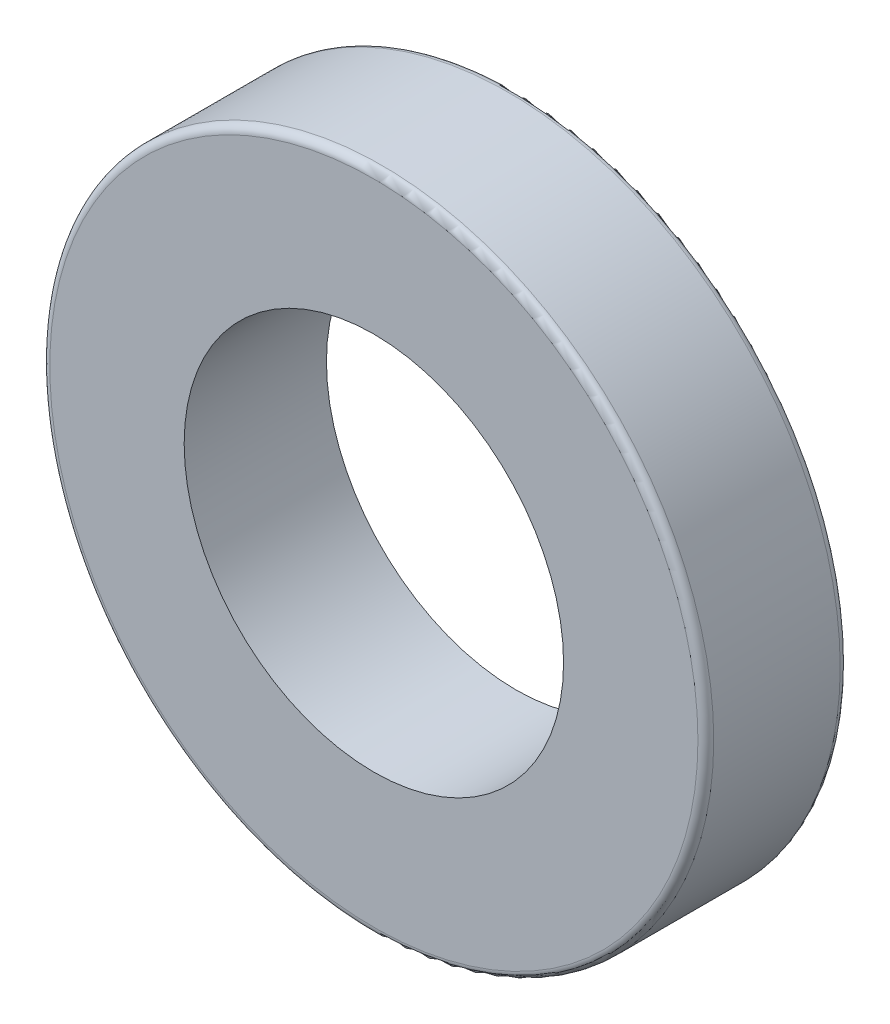
ISO-10303-21;
HEADER;
FILE_DESCRIPTION(('STEP AP214'),'2;1');
FILE_NAME('part.step','',(''),(''),'','','');
FILE_SCHEMA(('AUTOMOTIVE_DESIGN { 1 0 10303 214 1 1 1 1 }'));
ENDSEC;
DATA;
#1=APPLICATION_CONTEXT('core data for automotive mechanical design processes');
#2=APPLICATION_PROTOCOL_DEFINITION('international standard','automotive_design',2000,#1);
#3=PRODUCT_CONTEXT('',#1,'mechanical');
#4=PRODUCT('Part','Part','',(#3));
#5=PRODUCT_RELATED_PRODUCT_CATEGORY('part','',(#4));
#6=PRODUCT_DEFINITION_FORMATION('','',#4);
#7=PRODUCT_DEFINITION_CONTEXT('part definition',#1,'design');
#8=PRODUCT_DEFINITION('design','',#6,#7);
#9=PRODUCT_DEFINITION_SHAPE('','',#8);
#10=(LENGTH_UNIT() NAMED_UNIT(*) SI_UNIT(.MILLI.,.METRE.));
#11=(NAMED_UNIT(*) PLANE_ANGLE_UNIT() SI_UNIT($,.RADIAN.));
#12=(NAMED_UNIT(*) SI_UNIT($,.STERADIAN.) SOLID_ANGLE_UNIT());
#13=UNCERTAINTY_MEASURE_WITH_UNIT(LENGTH_MEASURE(1.E-05),#10,'distance_accuracy_value','');
#14=(GEOMETRIC_REPRESENTATION_CONTEXT(3) GLOBAL_UNCERTAINTY_ASSIGNED_CONTEXT((#13)) GLOBAL_UNIT_ASSIGNED_CONTEXT((#10,
#11,#12)) REPRESENTATION_CONTEXT('',''));
#15=CARTESIAN_POINT('',(0.,0.,0.));
#16=DIRECTION('',(0.,0.,1.));
#17=DIRECTION('',(1.,0.,0.));
#18=AXIS2_PLACEMENT_3D('',#15,#16,#17);
#19=CARTESIAN_POINT('',(0.,0.,-9.));
#20=DIRECTION('',(0.,0.,1.));
#21=DIRECTION('',(1.,0.,0.));
#22=AXIS2_PLACEMENT_3D('',#19,#20,#21);
#23=CYLINDRICAL_SURFACE('',#22,21.);
#24=CARTESIAN_POINT('',(0.,0.,-0.5));
#25=DIRECTION('',(0.,0.,1.));
#26=DIRECTION('',(1.,0.,0.));
#27=AXIS2_PLACEMENT_3D('',#24,#25,#26);
#28=CIRCLE('',#27,21.);
#29=CARTESIAN_POINT('',(21.,0.,-0.5));
#30=VERTEX_POINT('',#29);
#31=EDGE_CURVE('E40',#30,#30,#28,.F.);
#32=ORIENTED_EDGE('',*,*,#31,.T.);
#33=EDGE_LOOP('',(#32));
#34=FACE_BOUND('',#33,.T.);
#35=CARTESIAN_POINT('',(0.,0.,-8.5));
#36=DIRECTION('',(0.,0.,1.));
#37=DIRECTION('',(1.,0.,0.));
#38=AXIS2_PLACEMENT_3D('',#35,#36,#37);
#39=CIRCLE('',#38,21.);
#40=CARTESIAN_POINT('',(21.,0.,-8.5));
#41=VERTEX_POINT('',#40);
#42=EDGE_CURVE('E44',#41,#41,#39,.T.);
#43=ORIENTED_EDGE('',*,*,#42,.T.);
#44=EDGE_LOOP('',(#43));
#45=FACE_BOUND('',#44,.T.);
#46=ADVANCED_FACE('F33',(#34,#45),#23,.T.);
#47=CARTESIAN_POINT('',(0.,0.,-9.));
#48=DIRECTION('',(0.,0.,1.));
#49=DIRECTION('',(1.,0.,0.));
#50=AXIS2_PLACEMENT_3D('',#47,#48,#49);
#51=PLANE('',#50);
#52=CARTESIAN_POINT('',(0.,0.,-9.));
#53=DIRECTION('',(0.,0.,1.));
#54=DIRECTION('',(1.,0.,0.));
#55=AXIS2_PLACEMENT_3D('',#52,#53,#54);
#56=CIRCLE('',#55,20.5);
#57=CARTESIAN_POINT('',(20.5,0.,-9.));
#58=VERTEX_POINT('',#57);
#59=EDGE_CURVE('E10',#58,#58,#56,.F.);
#60=ORIENTED_EDGE('',*,*,#59,.T.);
#61=EDGE_LOOP('',(#60));
#62=FACE_BOUND('',#61,.T.);
#63=CARTESIAN_POINT('',(0.,0.,-9.));
#64=DIRECTION('',(0.,0.,1.));
#65=DIRECTION('',(1.,0.,0.));
#66=AXIS2_PLACEMENT_3D('',#63,#64,#65);
#67=CIRCLE('',#66,12.);
#68=CARTESIAN_POINT('',(12.,0.,-9.));
#69=VERTEX_POINT('',#68);
#70=EDGE_CURVE('E53',#69,#69,#67,.T.);
#71=ORIENTED_EDGE('',*,*,#70,.T.);
#72=EDGE_LOOP('',(#71));
#73=FACE_BOUND('',#72,.T.);
#74=ADVANCED_FACE('F60',(#62,#73),#51,.F.);
#75=CARTESIAN_POINT('',(0.,0.,0.));
#76=DIRECTION('',(0.,0.,1.));
#77=DIRECTION('',(1.,0.,0.));
#78=AXIS2_PLACEMENT_3D('',#75,#76,#77);
#79=PLANE('',#78);
#80=CARTESIAN_POINT('',(0.,0.,0.));
#81=DIRECTION('',(0.,0.,1.));
#82=DIRECTION('',(1.,0.,0.));
#83=AXIS2_PLACEMENT_3D('',#80,#81,#82);
#84=CIRCLE('',#83,20.5);
#85=CARTESIAN_POINT('',(20.5,0.,0.));
#86=VERTEX_POINT('',#85);
#87=EDGE_CURVE('E48',#86,#86,#84,.T.);
#88=ORIENTED_EDGE('',*,*,#87,.T.);
#89=EDGE_LOOP('',(#88));
#90=FACE_BOUND('',#89,.T.);
#91=CARTESIAN_POINT('',(0.,0.,0.));
#92=DIRECTION('',(0.,0.,1.));
#93=DIRECTION('',(1.,0.,0.));
#94=AXIS2_PLACEMENT_3D('',#91,#92,#93);
#95=CIRCLE('',#94,12.);
#96=CARTESIAN_POINT('',(12.,0.,0.));
#97=VERTEX_POINT('',#96);
#98=EDGE_CURVE('E54',#97,#97,#95,.T.);
#99=ORIENTED_EDGE('',*,*,#98,.F.);
#100=EDGE_LOOP('',(#99));
#101=FACE_BOUND('',#100,.T.);
#102=ADVANCED_FACE('F66',(#90,#101),#79,.T.);
#103=CARTESIAN_POINT('',(0.,0.,-9.));
#104=DIRECTION('',(0.,0.,1.));
#105=DIRECTION('',(1.,0.,0.));
#106=AXIS2_PLACEMENT_3D('',#103,#104,#105);
#107=CYLINDRICAL_SURFACE('',#106,12.);
#108=ORIENTED_EDGE('',*,*,#70,.F.);
#109=EDGE_LOOP('',(#108));
#110=FACE_BOUND('',#109,.T.);
#111=ORIENTED_EDGE('',*,*,#98,.T.);
#112=EDGE_LOOP('',(#111));
#113=FACE_BOUND('',#112,.T.);
#114=ADVANCED_FACE('F62',(#110,#113),#107,.F.);
#115=CARTESIAN_POINT('',(0.,0.,-0.5));
#116=DIRECTION('',(0.,0.,1.));
#117=DIRECTION('',(1.,0.,0.));
#118=AXIS2_PLACEMENT_3D('',#115,#116,#117);
#119=TOROIDAL_SURFACE('',#118,20.5,0.5);
#120=ORIENTED_EDGE('',*,*,#31,.F.);
#121=EDGE_LOOP('',(#120));
#122=FACE_BOUND('',#121,.T.);
#123=ORIENTED_EDGE('',*,*,#87,.F.);
#124=EDGE_LOOP('',(#123));
#125=FACE_BOUND('',#124,.T.);
#126=ADVANCED_FACE('F65',(#122,#125),#119,.T.);
#127=CARTESIAN_POINT('',(0.,0.,-8.5));
#128=DIRECTION('',(0.,0.,1.));
#129=DIRECTION('',(1.,0.,0.));
#130=AXIS2_PLACEMENT_3D('',#127,#128,#129);
#131=TOROIDAL_SURFACE('',#130,20.5,0.5);
#132=ORIENTED_EDGE('',*,*,#59,.F.);
#133=EDGE_LOOP('',(#132));
#134=FACE_BOUND('',#133,.T.);
#135=ORIENTED_EDGE('',*,*,#42,.F.);
#136=EDGE_LOOP('',(#135));
#137=FACE_BOUND('',#136,.T.);
#138=ADVANCED_FACE('F35',(#134,#137),#131,.T.);
#139=CLOSED_SHELL('',(#46,#74,#102,#114,#126,#138));
#140=MANIFOLD_SOLID_BREP('B2',#139);
#141=ADVANCED_BREP_SHAPE_REPRESENTATION('',(#18,#140),#14);
#142=SHAPE_DEFINITION_REPRESENTATION(#9,#141);
ENDSEC;
END-ISO-10303-21;
